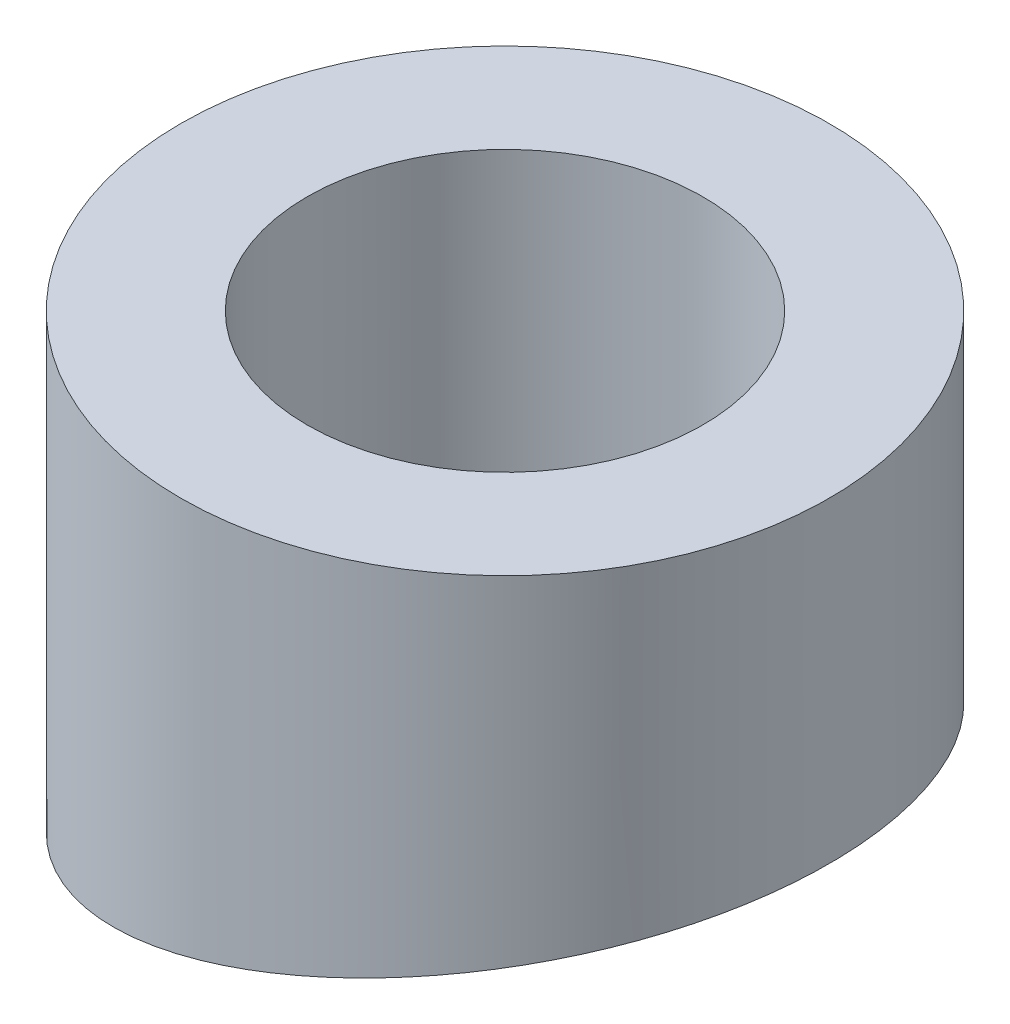
ISO-10303-21;
HEADER;
FILE_DESCRIPTION(('STEP AP214'),'2;1');
FILE_NAME('part.step','',(''),(''),'','','');
FILE_SCHEMA(('AUTOMOTIVE_DESIGN { 1 0 10303 214 1 1 1 1 }'));
ENDSEC;
DATA;
#1=APPLICATION_CONTEXT('core data for automotive mechanical design processes');
#2=APPLICATION_PROTOCOL_DEFINITION('international standard','automotive_design',2000,#1);
#3=PRODUCT_CONTEXT('',#1,'mechanical');
#4=PRODUCT('Part','Part','',(#3));
#5=PRODUCT_RELATED_PRODUCT_CATEGORY('part','',(#4));
#6=PRODUCT_DEFINITION_FORMATION('','',#4);
#7=PRODUCT_DEFINITION_CONTEXT('part definition',#1,'design');
#8=PRODUCT_DEFINITION('design','',#6,#7);
#9=PRODUCT_DEFINITION_SHAPE('','',#8);
#10=(LENGTH_UNIT() NAMED_UNIT(*) SI_UNIT(.MILLI.,.METRE.));
#11=(NAMED_UNIT(*) PLANE_ANGLE_UNIT() SI_UNIT($,.RADIAN.));
#12=(NAMED_UNIT(*) SI_UNIT($,.STERADIAN.) SOLID_ANGLE_UNIT());
#13=UNCERTAINTY_MEASURE_WITH_UNIT(LENGTH_MEASURE(1.E-05),#10,'distance_accuracy_value','');
#14=(GEOMETRIC_REPRESENTATION_CONTEXT(3) GLOBAL_UNCERTAINTY_ASSIGNED_CONTEXT((#13)) GLOBAL_UNIT_ASSIGNED_CONTEXT((#10,
#11,#12)) REPRESENTATION_CONTEXT('',''));
#15=CARTESIAN_POINT('',(0.,0.,0.));
#16=DIRECTION('',(0.,0.,1.));
#17=DIRECTION('',(1.,0.,0.));
#18=AXIS2_PLACEMENT_3D('',#15,#16,#17);
#19=CARTESIAN_POINT('',(0.,15.,0.));
#20=DIRECTION('',(0.,1.,0.));
#21=DIRECTION('',(0.,0.,1.));
#22=AXIS2_PLACEMENT_3D('',#19,#20,#21);
#23=PLANE('',#22);
#24=CARTESIAN_POINT('',(0.,15.,0.));
#25=DIRECTION('',(0.,1.,0.));
#26=DIRECTION('',(0.,0.,1.));
#27=AXIS2_PLACEMENT_3D('',#24,#25,#26);
#28=CIRCLE('',#27,10.25);
#29=CARTESIAN_POINT('',(0.,15.,10.25));
#30=VERTEX_POINT('',#29);
#31=EDGE_CURVE('E10',#30,#30,#28,.T.);
#32=ORIENTED_EDGE('',*,*,#31,.T.);
#33=EDGE_LOOP('',(#32));
#34=FACE_BOUND('',#33,.T.);
#35=CARTESIAN_POINT('',(0.,15.,0.));
#36=DIRECTION('',(0.,1.,0.));
#37=DIRECTION('',(0.,0.,1.));
#38=AXIS2_PLACEMENT_3D('',#35,#36,#37);
#39=CIRCLE('',#38,6.25);
#40=CARTESIAN_POINT('',(0.,15.,6.25));
#41=VERTEX_POINT('',#40);
#42=EDGE_CURVE('E46',#41,#41,#39,.T.);
#43=ORIENTED_EDGE('',*,*,#42,.F.);
#44=EDGE_LOOP('',(#43));
#45=FACE_BOUND('',#44,.T.);
#46=ADVANCED_FACE('F37',(#34,#45),#23,.T.);
#47=CARTESIAN_POINT('',(0.,15.,0.));
#48=DIRECTION('',(0.,-1.,0.));
#49=DIRECTION('',(0.,0.,-1.));
#50=AXIS2_PLACEMENT_3D('',#47,#48,#49);
#51=CYLINDRICAL_SURFACE('',#50,10.25);
#52=ORIENTED_EDGE('',*,*,#31,.F.);
#53=EDGE_LOOP('',(#52));
#54=FACE_BOUND('',#53,.T.);
#55=CARTESIAN_POINT('',(0.,2.5,0.));
#56=DIRECTION('',(-0.236956180191007,0.97152033878313,0.));
#57=DIRECTION('',(-0.97152033878313,-0.236956180191007,0.));
#58=AXIS2_PLACEMENT_3D('',#55,#56,#57);
#59=ELLIPSE('',#58,10.5504739230046,10.25);
#60=CARTESIAN_POINT('',(-10.25,0.,0.));
#61=VERTEX_POINT('',#60);
#62=EDGE_CURVE('E51',#61,#61,#59,.T.);
#63=ORIENTED_EDGE('',*,*,#62,.T.);
#64=EDGE_LOOP('',(#63));
#65=FACE_BOUND('',#64,.T.);
#66=ADVANCED_FACE('F39',(#54,#65),#51,.T.);
#67=CARTESIAN_POINT('',(0.,15.,0.));
#68=DIRECTION('',(0.,-1.,0.));
#69=DIRECTION('',(0.,0.,-1.));
#70=AXIS2_PLACEMENT_3D('',#67,#68,#69);
#71=CYLINDRICAL_SURFACE('',#70,6.25);
#72=CARTESIAN_POINT('',(0.,2.5,0.));
#73=DIRECTION('',(-0.236956180191007,0.97152033878313,0.));
#74=DIRECTION('',(-0.97152033878313,-0.236956180191007,0.));
#75=AXIS2_PLACEMENT_3D('',#72,#73,#74);
#76=ELLIPSE('',#75,6.43321580671012,6.25);
#77=CARTESIAN_POINT('',(-6.25,0.975609756097561,0.));
#78=VERTEX_POINT('',#77);
#79=EDGE_CURVE('E41',#78,#78,#76,.T.);
#80=ORIENTED_EDGE('',*,*,#79,.F.);
#81=EDGE_LOOP('',(#80));
#82=FACE_BOUND('',#81,.T.);
#83=ORIENTED_EDGE('',*,*,#42,.T.);
#84=EDGE_LOOP('',(#83));
#85=FACE_BOUND('',#84,.T.);
#86=ADVANCED_FACE('F65',(#82,#85),#71,.F.);
#87=CARTESIAN_POINT('',(-10.25,0.,-15.));
#88=DIRECTION('',(-0.236956180191007,0.97152033878313,0.));
#89=DIRECTION('',(-0.97152033878313,-0.236956180191007,0.));
#90=AXIS2_PLACEMENT_3D('',#87,#88,#89);
#91=PLANE('',#90);
#92=ORIENTED_EDGE('',*,*,#79,.T.);
#93=EDGE_LOOP('',(#92));
#94=FACE_BOUND('',#93,.T.);
#95=ORIENTED_EDGE('',*,*,#62,.F.);
#96=EDGE_LOOP('',(#95));
#97=FACE_BOUND('',#96,.T.);
#98=ADVANCED_FACE('F62',(#94,#97),#91,.F.);
#99=CLOSED_SHELL('',(#46,#66,#86,#98));
#100=MANIFOLD_SOLID_BREP('B2',#99);
#101=ADVANCED_BREP_SHAPE_REPRESENTATION('',(#18,#100),#14);
#102=SHAPE_DEFINITION_REPRESENTATION(#9,#101);
ENDSEC;
END-ISO-10303-21;
